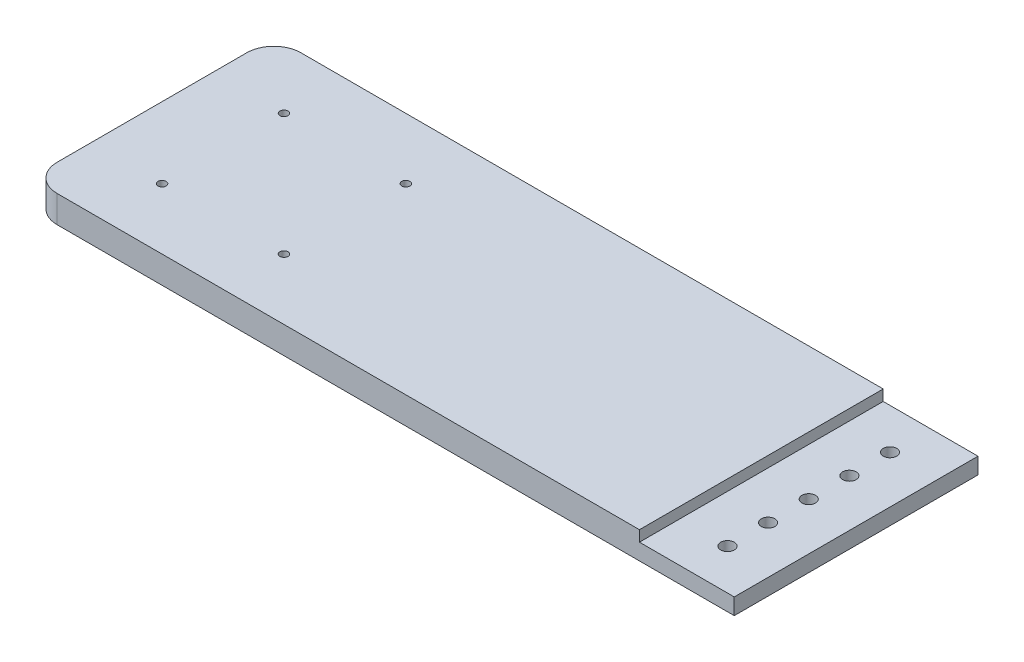
ISO-10303-21;
HEADER;
FILE_DESCRIPTION(('STEP AP214'),'2;1');
FILE_NAME('part.step','',(''),(''),'','','');
FILE_SCHEMA(('AUTOMOTIVE_DESIGN { 1 0 10303 214 1 1 1 1 }'));
ENDSEC;
DATA;
#1=APPLICATION_CONTEXT('core data for automotive mechanical design processes');
#2=APPLICATION_PROTOCOL_DEFINITION('international standard','automotive_design',2000,#1);
#3=PRODUCT_CONTEXT('',#1,'mechanical');
#4=PRODUCT('Part','Part','',(#3));
#5=PRODUCT_RELATED_PRODUCT_CATEGORY('part','',(#4));
#6=PRODUCT_DEFINITION_FORMATION('','',#4);
#7=PRODUCT_DEFINITION_CONTEXT('part definition',#1,'design');
#8=PRODUCT_DEFINITION('design','',#6,#7);
#9=PRODUCT_DEFINITION_SHAPE('','',#8);
#10=(LENGTH_UNIT() NAMED_UNIT(*) SI_UNIT(.MILLI.,.METRE.));
#11=(NAMED_UNIT(*) PLANE_ANGLE_UNIT() SI_UNIT($,.RADIAN.));
#12=(NAMED_UNIT(*) SI_UNIT($,.STERADIAN.) SOLID_ANGLE_UNIT());
#13=UNCERTAINTY_MEASURE_WITH_UNIT(LENGTH_MEASURE(1.E-05),#10,'distance_accuracy_value','');
#14=(GEOMETRIC_REPRESENTATION_CONTEXT(3) GLOBAL_UNCERTAINTY_ASSIGNED_CONTEXT((#13)) GLOBAL_UNIT_ASSIGNED_CONTEXT((#10,
#11,#12)) REPRESENTATION_CONTEXT('',''));
#15=CARTESIAN_POINT('',(0.,0.,0.));
#16=DIRECTION('',(0.,0.,1.));
#17=DIRECTION('',(1.,0.,0.));
#18=AXIS2_PLACEMENT_3D('',#15,#16,#17);
#19=CARTESIAN_POINT('',(26.2394886975501,0.,22.5));
#20=DIRECTION('',(0.,1.,0.));
#21=DIRECTION('',(0.,0.,1.));
#22=AXIS2_PLACEMENT_3D('',#19,#20,#21);
#23=CYLINDRICAL_SURFACE('',#22,1.5);
#24=CARTESIAN_POINT('',(26.2394886975501,10.,22.5));
#25=DIRECTION('',(0.,1.,0.));
#26=DIRECTION('',(0.,0.,1.));
#27=AXIS2_PLACEMENT_3D('',#24,#25,#26);
#28=CIRCLE('',#27,1.5);
#29=CARTESIAN_POINT('',(26.2394886975501,10.,24.));
#30=VERTEX_POINT('',#29);
#31=EDGE_CURVE('E183',#30,#30,#28,.T.);
#32=ORIENTED_EDGE('',*,*,#31,.T.);
#33=EDGE_LOOP('',(#32));
#34=FACE_BOUND('',#33,.T.);
#35=CARTESIAN_POINT('',(26.2394886975501,5.,22.5));
#36=DIRECTION('',(0.,-1.,0.));
#37=DIRECTION('',(0.,0.,-1.));
#38=AXIS2_PLACEMENT_3D('',#35,#36,#37);
#39=CIRCLE('',#38,1.5);
#40=CARTESIAN_POINT('',(26.2394886975501,5.,21.));
#41=VERTEX_POINT('',#40);
#42=EDGE_CURVE('E206',#41,#41,#39,.T.);
#43=ORIENTED_EDGE('',*,*,#42,.T.);
#44=EDGE_LOOP('',(#43));
#45=FACE_BOUND('',#44,.T.);
#46=ADVANCED_FACE('F43',(#34,#45),#23,.F.);
#47=CARTESIAN_POINT('',(26.2394886975501,0.,67.5));
#48=DIRECTION('',(0.,1.,0.));
#49=DIRECTION('',(0.,0.,1.));
#50=AXIS2_PLACEMENT_3D('',#47,#48,#49);
#51=CYLINDRICAL_SURFACE('',#50,1.5);
#52=CARTESIAN_POINT('',(26.2394886975501,10.,67.5));
#53=DIRECTION('',(0.,1.,0.));
#54=DIRECTION('',(0.,0.,1.));
#55=AXIS2_PLACEMENT_3D('',#52,#53,#54);
#56=CIRCLE('',#55,1.5);
#57=CARTESIAN_POINT('',(26.2394886975501,10.,69.));
#58=VERTEX_POINT('',#57);
#59=EDGE_CURVE('E188',#58,#58,#56,.T.);
#60=ORIENTED_EDGE('',*,*,#59,.T.);
#61=EDGE_LOOP('',(#60));
#62=FACE_BOUND('',#61,.T.);
#63=CARTESIAN_POINT('',(26.2394886975501,5.,67.5));
#64=DIRECTION('',(0.,-1.,0.));
#65=DIRECTION('',(0.,0.,-1.));
#66=AXIS2_PLACEMENT_3D('',#63,#64,#65);
#67=CIRCLE('',#66,1.5);
#68=CARTESIAN_POINT('',(26.2394886975501,5.,66.));
#69=VERTEX_POINT('',#68);
#70=EDGE_CURVE('E201',#69,#69,#67,.T.);
#71=ORIENTED_EDGE('',*,*,#70,.T.);
#72=EDGE_LOOP('',(#71));
#73=FACE_BOUND('',#72,.T.);
#74=ADVANCED_FACE('F316',(#62,#73),#51,.F.);
#75=CARTESIAN_POINT('',(71.2394886975501,0.,67.5));
#76=DIRECTION('',(0.,1.,0.));
#77=DIRECTION('',(0.,0.,1.));
#78=AXIS2_PLACEMENT_3D('',#75,#76,#77);
#79=CYLINDRICAL_SURFACE('',#78,1.5);
#80=CARTESIAN_POINT('',(71.2394886975501,10.,67.5));
#81=DIRECTION('',(0.,1.,0.));
#82=DIRECTION('',(0.,0.,1.));
#83=AXIS2_PLACEMENT_3D('',#80,#81,#82);
#84=CIRCLE('',#83,1.5);
#85=CARTESIAN_POINT('',(71.2394886975501,10.,69.));
#86=VERTEX_POINT('',#85);
#87=EDGE_CURVE('E192',#86,#86,#84,.T.);
#88=ORIENTED_EDGE('',*,*,#87,.T.);
#89=EDGE_LOOP('',(#88));
#90=FACE_BOUND('',#89,.T.);
#91=CARTESIAN_POINT('',(71.2394886975501,5.,67.5));
#92=DIRECTION('',(0.,-1.,0.));
#93=DIRECTION('',(0.,0.,-1.));
#94=AXIS2_PLACEMENT_3D('',#91,#92,#93);
#95=CIRCLE('',#94,1.5);
#96=CARTESIAN_POINT('',(71.2394886975501,5.,66.));
#97=VERTEX_POINT('',#96);
#98=EDGE_CURVE('E207',#97,#97,#95,.T.);
#99=ORIENTED_EDGE('',*,*,#98,.T.);
#100=EDGE_LOOP('',(#99));
#101=FACE_BOUND('',#100,.T.);
#102=ADVANCED_FACE('F323',(#90,#101),#79,.F.);
#103=CARTESIAN_POINT('',(71.2394886975501,0.,22.5));
#104=DIRECTION('',(0.,1.,0.));
#105=DIRECTION('',(0.,0.,1.));
#106=AXIS2_PLACEMENT_3D('',#103,#104,#105);
#107=CYLINDRICAL_SURFACE('',#106,1.5);
#108=CARTESIAN_POINT('',(71.2394886975501,10.,22.5));
#109=DIRECTION('',(0.,1.,0.));
#110=DIRECTION('',(0.,0.,1.));
#111=AXIS2_PLACEMENT_3D('',#108,#109,#110);
#112=CIRCLE('',#111,1.5);
#113=CARTESIAN_POINT('',(71.2394886975501,10.,24.));
#114=VERTEX_POINT('',#113);
#115=EDGE_CURVE('E189',#114,#114,#112,.T.);
#116=ORIENTED_EDGE('',*,*,#115,.T.);
#117=EDGE_LOOP('',(#116));
#118=FACE_BOUND('',#117,.T.);
#119=CARTESIAN_POINT('',(71.2394886975501,5.,22.5));
#120=DIRECTION('',(0.,-1.,0.));
#121=DIRECTION('',(0.,0.,-1.));
#122=AXIS2_PLACEMENT_3D('',#119,#120,#121);
#123=CIRCLE('',#122,1.5);
#124=CARTESIAN_POINT('',(71.2394886975501,5.,21.));
#125=VERTEX_POINT('',#124);
#126=EDGE_CURVE('E218',#125,#125,#123,.T.);
#127=ORIENTED_EDGE('',*,*,#126,.T.);
#128=EDGE_LOOP('',(#127));
#129=FACE_BOUND('',#128,.T.);
#130=ADVANCED_FACE('F327',(#118,#129),#107,.F.);
#131=CARTESIAN_POINT('',(0.,10.,0.));
#132=DIRECTION('',(1.,0.,0.));
#133=DIRECTION('',(0.,0.,-1.));
#134=AXIS2_PLACEMENT_3D('',#131,#132,#133);
#135=PLANE('',#134);
#136=DIRECTION('',(0.,0.,1.));
#137=VECTOR('',#136,1.);
#138=CARTESIAN_POINT('',(0.,10.,0.));
#139=LINE('',#138,#137);
#140=CARTESIAN_POINT('',(0.,10.,10.));
#141=VERTEX_POINT('',#140);
#142=CARTESIAN_POINT('',(0.,10.,80.));
#143=VERTEX_POINT('',#142);
#144=EDGE_CURVE('E158',#141,#143,#139,.T.);
#145=ORIENTED_EDGE('',*,*,#144,.F.);
#146=DIRECTION('',(0.,-1.,0.));
#147=VECTOR('',#146,1.);
#148=CARTESIAN_POINT('',(0.,10.,10.));
#149=LINE('',#148,#147);
#150=CARTESIAN_POINT('',(0.,0.,10.));
#151=VERTEX_POINT('',#150);
#152=EDGE_CURVE('E147',#141,#151,#149,.T.);
#153=ORIENTED_EDGE('',*,*,#152,.T.);
#154=DIRECTION('',(0.,0.,1.));
#155=VECTOR('',#154,1.);
#156=CARTESIAN_POINT('',(0.,0.,0.));
#157=LINE('',#156,#155);
#158=CARTESIAN_POINT('',(0.,0.,80.));
#159=VERTEX_POINT('',#158);
#160=EDGE_CURVE('E171',#151,#159,#157,.T.);
#161=ORIENTED_EDGE('',*,*,#160,.T.);
#162=DIRECTION('',(0.,-1.,0.));
#163=VECTOR('',#162,1.);
#164=CARTESIAN_POINT('',(0.,10.,80.));
#165=LINE('',#164,#163);
#166=EDGE_CURVE('E138',#159,#143,#165,.F.);
#167=ORIENTED_EDGE('',*,*,#166,.T.);
#168=EDGE_LOOP('',(#145,#153,#161,#167));
#169=FACE_BOUND('',#168,.T.);
#170=ADVANCED_FACE('F163',(#169),#135,.F.);
#171=CARTESIAN_POINT('',(0.,10.,90.));
#172=DIRECTION('',(0.,0.,-1.));
#173=DIRECTION('',(-1.,0.,0.));
#174=AXIS2_PLACEMENT_3D('',#171,#172,#173);
#175=PLANE('',#174);
#176=DIRECTION('',(1.,0.,0.));
#177=VECTOR('',#176,1.);
#178=CARTESIAN_POINT('',(0.,10.,90.));
#179=LINE('',#178,#177);
#180=CARTESIAN_POINT('',(10.,10.,90.));
#181=VERTEX_POINT('',#180);
#182=CARTESIAN_POINT('',(225.,10.,90.));
#183=VERTEX_POINT('',#182);
#184=EDGE_CURVE('E140',#181,#183,#179,.T.);
#185=ORIENTED_EDGE('',*,*,#184,.F.);
#186=DIRECTION('',(0.,-1.,0.));
#187=VECTOR('',#186,1.);
#188=CARTESIAN_POINT('',(10.,10.,90.));
#189=LINE('',#188,#187);
#190=CARTESIAN_POINT('',(10.,0.,90.));
#191=VERTEX_POINT('',#190);
#192=EDGE_CURVE('E11',#181,#191,#189,.T.);
#193=ORIENTED_EDGE('',*,*,#192,.T.);
#194=DIRECTION('',(1.,0.,0.));
#195=VECTOR('',#194,1.);
#196=CARTESIAN_POINT('',(0.,0.,90.));
#197=LINE('',#196,#195);
#198=CARTESIAN_POINT('',(260.,0.,90.));
#199=VERTEX_POINT('',#198);
#200=EDGE_CURVE('E172',#191,#199,#197,.T.);
#201=ORIENTED_EDGE('',*,*,#200,.T.);
#202=DIRECTION('',(0.,-1.,0.));
#203=VECTOR('',#202,1.);
#204=CARTESIAN_POINT('',(260.,10.,90.));
#205=LINE('',#204,#203);
#206=CARTESIAN_POINT('',(260.,6.,90.));
#207=VERTEX_POINT('',#206);
#208=EDGE_CURVE('E135',#207,#199,#205,.T.);
#209=ORIENTED_EDGE('',*,*,#208,.F.);
#210=DIRECTION('',(1.,0.,0.));
#211=VECTOR('',#210,1.);
#212=CARTESIAN_POINT('',(260.,6.,90.));
#213=LINE('',#212,#211);
#214=CARTESIAN_POINT('',(225.,6.,90.));
#215=VERTEX_POINT('',#214);
#216=EDGE_CURVE('E118',#215,#207,#213,.T.);
#217=ORIENTED_EDGE('',*,*,#216,.F.);
#218=DIRECTION('',(0.,1.,0.));
#219=VECTOR('',#218,1.);
#220=CARTESIAN_POINT('',(225.,6.,90.));
#221=LINE('',#220,#219);
#222=EDGE_CURVE('E175',#215,#183,#221,.T.);
#223=ORIENTED_EDGE('',*,*,#222,.T.);
#224=EDGE_LOOP('',(#185,#193,#201,#209,#217,#223));
#225=FACE_BOUND('',#224,.T.);
#226=ADVANCED_FACE('F339',(#225),#175,.F.);
#227=CARTESIAN_POINT('',(260.,10.,0.));
#228=DIRECTION('',(-1.,0.,0.));
#229=DIRECTION('',(0.,0.,1.));
#230=AXIS2_PLACEMENT_3D('',#227,#228,#229);
#231=PLANE('',#230);
#232=DIRECTION('',(0.,-1.,0.));
#233=VECTOR('',#232,1.);
#234=CARTESIAN_POINT('',(260.,10.,0.));
#235=LINE('',#234,#233);
#236=CARTESIAN_POINT('',(260.,6.,0.));
#237=VERTEX_POINT('',#236);
#238=CARTESIAN_POINT('',(260.,0.,0.));
#239=VERTEX_POINT('',#238);
#240=EDGE_CURVE('E126',#237,#239,#235,.T.);
#241=ORIENTED_EDGE('',*,*,#240,.F.);
#242=DIRECTION('',(0.,0.,-1.));
#243=VECTOR('',#242,1.);
#244=CARTESIAN_POINT('',(260.,6.,0.));
#245=LINE('',#244,#243);
#246=EDGE_CURVE('E111',#207,#237,#245,.T.);
#247=ORIENTED_EDGE('',*,*,#246,.F.);
#248=ORIENTED_EDGE('',*,*,#208,.T.);
#249=DIRECTION('',(0.,0.,-1.));
#250=VECTOR('',#249,1.);
#251=CARTESIAN_POINT('',(260.,0.,0.));
#252=LINE('',#251,#250);
#253=EDGE_CURVE('E133',#199,#239,#252,.T.);
#254=ORIENTED_EDGE('',*,*,#253,.T.);
#255=EDGE_LOOP('',(#241,#247,#248,#254));
#256=FACE_BOUND('',#255,.T.);
#257=ADVANCED_FACE('F131',(#256),#231,.F.);
#258=CARTESIAN_POINT('',(0.,10.,0.));
#259=DIRECTION('',(0.,0.,1.));
#260=DIRECTION('',(1.,0.,0.));
#261=AXIS2_PLACEMENT_3D('',#258,#259,#260);
#262=PLANE('',#261);
#263=DIRECTION('',(-1.,0.,0.));
#264=VECTOR('',#263,1.);
#265=CARTESIAN_POINT('',(0.,0.,0.));
#266=LINE('',#265,#264);
#267=CARTESIAN_POINT('',(10.,0.,0.));
#268=VERTEX_POINT('',#267);
#269=EDGE_CURVE('E143',#239,#268,#266,.T.);
#270=ORIENTED_EDGE('',*,*,#269,.T.);
#271=DIRECTION('',(0.,-1.,0.));
#272=VECTOR('',#271,1.);
#273=CARTESIAN_POINT('',(10.,10.,0.));
#274=LINE('',#273,#272);
#275=CARTESIAN_POINT('',(10.,10.,0.));
#276=VERTEX_POINT('',#275);
#277=EDGE_CURVE('E66',#268,#276,#274,.F.);
#278=ORIENTED_EDGE('',*,*,#277,.T.);
#279=DIRECTION('',(-1.,0.,0.));
#280=VECTOR('',#279,1.);
#281=CARTESIAN_POINT('',(0.,10.,0.));
#282=LINE('',#281,#280);
#283=CARTESIAN_POINT('',(225.,10.,0.));
#284=VERTEX_POINT('',#283);
#285=EDGE_CURVE('E136',#284,#276,#282,.T.);
#286=ORIENTED_EDGE('',*,*,#285,.F.);
#287=DIRECTION('',(0.,1.,0.));
#288=VECTOR('',#287,1.);
#289=CARTESIAN_POINT('',(225.,6.,0.));
#290=LINE('',#289,#288);
#291=CARTESIAN_POINT('',(225.,6.,0.));
#292=VERTEX_POINT('',#291);
#293=EDGE_CURVE('E128',#292,#284,#290,.T.);
#294=ORIENTED_EDGE('',*,*,#293,.F.);
#295=DIRECTION('',(-1.,0.,0.));
#296=VECTOR('',#295,1.);
#297=CARTESIAN_POINT('',(260.,6.,0.));
#298=LINE('',#297,#296);
#299=EDGE_CURVE('E115',#237,#292,#298,.T.);
#300=ORIENTED_EDGE('',*,*,#299,.F.);
#301=ORIENTED_EDGE('',*,*,#240,.T.);
#302=EDGE_LOOP('',(#270,#278,#286,#294,#300,#301));
#303=FACE_BOUND('',#302,.T.);
#304=ADVANCED_FACE('F125',(#303),#262,.F.);
#305=CARTESIAN_POINT('',(0.,10.,0.));
#306=DIRECTION('',(0.,1.,0.));
#307=DIRECTION('',(0.,0.,1.));
#308=AXIS2_PLACEMENT_3D('',#305,#306,#307);
#309=PLANE('',#308);
#310=ORIENTED_EDGE('',*,*,#115,.F.);
#311=EDGE_LOOP('',(#310));
#312=FACE_BOUND('',#311,.T.);
#313=ORIENTED_EDGE('',*,*,#87,.F.);
#314=EDGE_LOOP('',(#313));
#315=FACE_BOUND('',#314,.T.);
#316=ORIENTED_EDGE('',*,*,#59,.F.);
#317=EDGE_LOOP('',(#316));
#318=FACE_BOUND('',#317,.T.);
#319=ORIENTED_EDGE('',*,*,#31,.F.);
#320=EDGE_LOOP('',(#319));
#321=FACE_BOUND('',#320,.T.);
#322=ORIENTED_EDGE('',*,*,#285,.T.);
#323=CARTESIAN_POINT('',(10.,10.,10.));
#324=DIRECTION('',(0.,1.,0.));
#325=DIRECTION('',(0.,0.,1.));
#326=AXIS2_PLACEMENT_3D('',#323,#324,#325);
#327=CIRCLE('',#326,10.);
#328=EDGE_CURVE('E51',#276,#141,#327,.T.);
#329=ORIENTED_EDGE('',*,*,#328,.T.);
#330=ORIENTED_EDGE('',*,*,#144,.T.);
#331=CARTESIAN_POINT('',(10.,10.,80.));
#332=DIRECTION('',(0.,1.,0.));
#333=DIRECTION('',(0.,0.,1.));
#334=AXIS2_PLACEMENT_3D('',#331,#332,#333);
#335=CIRCLE('',#334,10.);
#336=EDGE_CURVE('E58',#143,#181,#335,.T.);
#337=ORIENTED_EDGE('',*,*,#336,.T.);
#338=ORIENTED_EDGE('',*,*,#184,.T.);
#339=DIRECTION('',(0.,0.,1.));
#340=VECTOR('',#339,1.);
#341=CARTESIAN_POINT('',(225.,10.,0.));
#342=LINE('',#341,#340);
#343=EDGE_CURVE('E123',#284,#183,#342,.T.);
#344=ORIENTED_EDGE('',*,*,#343,.F.);
#345=EDGE_LOOP('',(#322,#329,#330,#337,#338,#344));
#346=FACE_BOUND('',#345,.T.);
#347=ADVANCED_FACE('F157',(#312,#315,#318,#321,#346),#309,.T.);
#348=CARTESIAN_POINT('',(0.,0.,0.));
#349=DIRECTION('',(0.,1.,0.));
#350=DIRECTION('',(0.,0.,1.));
#351=AXIS2_PLACEMENT_3D('',#348,#349,#350);
#352=PLANE('',#351);
#353=CARTESIAN_POINT('',(242.5,0.,15.));
#354=DIRECTION('',(0.,1.,0.));
#355=DIRECTION('',(0.,0.,1.));
#356=AXIS2_PLACEMENT_3D('',#353,#354,#355);
#357=CIRCLE('',#356,2.5);
#358=CARTESIAN_POINT('',(242.5,0.,17.5));
#359=VERTEX_POINT('',#358);
#360=EDGE_CURVE('E215',#359,#359,#357,.T.);
#361=ORIENTED_EDGE('',*,*,#360,.T.);
#362=EDGE_LOOP('',(#361));
#363=FACE_BOUND('',#362,.T.);
#364=CARTESIAN_POINT('',(242.5,0.,75.));
#365=DIRECTION('',(0.,1.,0.));
#366=DIRECTION('',(0.,0.,1.));
#367=AXIS2_PLACEMENT_3D('',#364,#365,#366);
#368=CIRCLE('',#367,2.5);
#369=CARTESIAN_POINT('',(242.5,0.,77.5));
#370=VERTEX_POINT('',#369);
#371=EDGE_CURVE('E236',#370,#370,#368,.T.);
#372=ORIENTED_EDGE('',*,*,#371,.T.);
#373=EDGE_LOOP('',(#372));
#374=FACE_BOUND('',#373,.T.);
#375=CARTESIAN_POINT('',(242.5,0.,30.));
#376=DIRECTION('',(0.,1.,0.));
#377=DIRECTION('',(0.,0.,1.));
#378=AXIS2_PLACEMENT_3D('',#375,#376,#377);
#379=CIRCLE('',#378,2.5);
#380=CARTESIAN_POINT('',(242.5,0.,32.5));
#381=VERTEX_POINT('',#380);
#382=EDGE_CURVE('E239',#381,#381,#379,.T.);
#383=ORIENTED_EDGE('',*,*,#382,.T.);
#384=EDGE_LOOP('',(#383));
#385=FACE_BOUND('',#384,.T.);
#386=CARTESIAN_POINT('',(242.5,0.,60.));
#387=DIRECTION('',(0.,1.,0.));
#388=DIRECTION('',(0.,0.,1.));
#389=AXIS2_PLACEMENT_3D('',#386,#387,#388);
#390=CIRCLE('',#389,2.5);
#391=CARTESIAN_POINT('',(242.5,0.,62.5));
#392=VERTEX_POINT('',#391);
#393=EDGE_CURVE('E242',#392,#392,#390,.T.);
#394=ORIENTED_EDGE('',*,*,#393,.T.);
#395=EDGE_LOOP('',(#394));
#396=FACE_BOUND('',#395,.T.);
#397=CARTESIAN_POINT('',(242.5,0.,45.));
#398=DIRECTION('',(0.,1.,0.));
#399=DIRECTION('',(0.,0.,1.));
#400=AXIS2_PLACEMENT_3D('',#397,#398,#399);
#401=CIRCLE('',#400,2.5);
#402=CARTESIAN_POINT('',(242.5,0.,47.5));
#403=VERTEX_POINT('',#402);
#404=EDGE_CURVE('E245',#403,#403,#401,.T.);
#405=ORIENTED_EDGE('',*,*,#404,.T.);
#406=EDGE_LOOP('',(#405));
#407=FACE_BOUND('',#406,.T.);
#408=CARTESIAN_POINT('',(71.2394886975501,0.,67.5));
#409=DIRECTION('',(0.,-1.,0.));
#410=DIRECTION('',(0.,0.,-1.));
#411=AXIS2_PLACEMENT_3D('',#408,#409,#410);
#412=CIRCLE('',#411,3.50000000000001);
#413=CARTESIAN_POINT('',(71.2394886975501,0.,64.));
#414=VERTEX_POINT('',#413);
#415=EDGE_CURVE('E211',#414,#414,#412,.T.);
#416=ORIENTED_EDGE('',*,*,#415,.F.);
#417=EDGE_LOOP('',(#416));
#418=FACE_BOUND('',#417,.T.);
#419=CARTESIAN_POINT('',(71.2394886975501,0.,22.5));
#420=DIRECTION('',(0.,-1.,0.));
#421=DIRECTION('',(0.,0.,-1.));
#422=AXIS2_PLACEMENT_3D('',#419,#420,#421);
#423=CIRCLE('',#422,3.50000000000001);
#424=CARTESIAN_POINT('',(71.2394886975501,0.,19.));
#425=VERTEX_POINT('',#424);
#426=EDGE_CURVE('E222',#425,#425,#423,.T.);
#427=ORIENTED_EDGE('',*,*,#426,.F.);
#428=EDGE_LOOP('',(#427));
#429=FACE_BOUND('',#428,.T.);
#430=CARTESIAN_POINT('',(26.2394886975501,0.,22.5));
#431=DIRECTION('',(0.,-1.,0.));
#432=DIRECTION('',(0.,0.,-1.));
#433=AXIS2_PLACEMENT_3D('',#430,#431,#432);
#434=CIRCLE('',#433,3.5);
#435=CARTESIAN_POINT('',(26.2394886975501,0.,19.));
#436=VERTEX_POINT('',#435);
#437=EDGE_CURVE('E229',#436,#436,#434,.T.);
#438=ORIENTED_EDGE('',*,*,#437,.F.);
#439=EDGE_LOOP('',(#438));
#440=FACE_BOUND('',#439,.T.);
#441=CARTESIAN_POINT('',(26.2394886975501,0.,67.5));
#442=DIRECTION('',(0.,-1.,0.));
#443=DIRECTION('',(0.,0.,-1.));
#444=AXIS2_PLACEMENT_3D('',#441,#442,#443);
#445=CIRCLE('',#444,3.5);
#446=CARTESIAN_POINT('',(26.2394886975501,0.,64.));
#447=VERTEX_POINT('',#446);
#448=EDGE_CURVE('E198',#447,#447,#445,.T.);
#449=ORIENTED_EDGE('',*,*,#448,.F.);
#450=EDGE_LOOP('',(#449));
#451=FACE_BOUND('',#450,.T.);
#452=ORIENTED_EDGE('',*,*,#160,.F.);
#453=CARTESIAN_POINT('',(10.,0.,10.));
#454=DIRECTION('',(0.,1.,0.));
#455=DIRECTION('',(0.,0.,1.));
#456=AXIS2_PLACEMENT_3D('',#453,#454,#455);
#457=CIRCLE('',#456,10.);
#458=EDGE_CURVE('E152',#151,#268,#457,.F.);
#459=ORIENTED_EDGE('',*,*,#458,.T.);
#460=ORIENTED_EDGE('',*,*,#269,.F.);
#461=ORIENTED_EDGE('',*,*,#253,.F.);
#462=ORIENTED_EDGE('',*,*,#200,.F.);
#463=CARTESIAN_POINT('',(10.,0.,80.));
#464=DIRECTION('',(0.,1.,0.));
#465=DIRECTION('',(0.,0.,1.));
#466=AXIS2_PLACEMENT_3D('',#463,#464,#465);
#467=CIRCLE('',#466,10.);
#468=EDGE_CURVE('E150',#191,#159,#467,.F.);
#469=ORIENTED_EDGE('',*,*,#468,.T.);
#470=EDGE_LOOP('',(#452,#459,#460,#461,#462,#469));
#471=FACE_BOUND('',#470,.T.);
#472=ADVANCED_FACE('F170',(#363,#374,#385,#396,#407,#418,#429,#440,#451,#471),#352,.F.);
#473=CARTESIAN_POINT('',(225.,6.,0.));
#474=DIRECTION('',(-1.,0.,0.));
#475=DIRECTION('',(0.,0.,1.));
#476=AXIS2_PLACEMENT_3D('',#473,#474,#475);
#477=PLANE('',#476);
#478=ORIENTED_EDGE('',*,*,#343,.T.);
#479=ORIENTED_EDGE('',*,*,#222,.F.);
#480=DIRECTION('',(0.,0.,1.));
#481=VECTOR('',#480,1.);
#482=CARTESIAN_POINT('',(225.,6.,0.));
#483=LINE('',#482,#481);
#484=EDGE_CURVE('E129',#292,#215,#483,.T.);
#485=ORIENTED_EDGE('',*,*,#484,.F.);
#486=ORIENTED_EDGE('',*,*,#293,.T.);
#487=EDGE_LOOP('',(#478,#479,#485,#486));
#488=FACE_BOUND('',#487,.T.);
#489=ADVANCED_FACE('F270',(#488),#477,.F.);
#490=CARTESIAN_POINT('',(0.,6.,0.));
#491=DIRECTION('',(0.,-1.,0.));
#492=DIRECTION('',(0.,0.,-1.));
#493=AXIS2_PLACEMENT_3D('',#490,#491,#492);
#494=PLANE('',#493);
#495=CARTESIAN_POINT('',(242.5,6.,15.));
#496=DIRECTION('',(0.,1.,0.));
#497=DIRECTION('',(0.,0.,1.));
#498=AXIS2_PLACEMENT_3D('',#495,#496,#497);
#499=CIRCLE('',#498,2.5);
#500=CARTESIAN_POINT('',(242.5,6.,17.5));
#501=VERTEX_POINT('',#500);
#502=EDGE_CURVE('E251',#501,#501,#499,.T.);
#503=ORIENTED_EDGE('',*,*,#502,.F.);
#504=EDGE_LOOP('',(#503));
#505=FACE_BOUND('',#504,.T.);
#506=CARTESIAN_POINT('',(242.5,6.,75.));
#507=DIRECTION('',(0.,1.,0.));
#508=DIRECTION('',(0.,0.,1.));
#509=AXIS2_PLACEMENT_3D('',#506,#507,#508);
#510=CIRCLE('',#509,2.5);
#511=CARTESIAN_POINT('',(242.5,6.,77.5));
#512=VERTEX_POINT('',#511);
#513=EDGE_CURVE('E252',#512,#512,#510,.T.);
#514=ORIENTED_EDGE('',*,*,#513,.F.);
#515=EDGE_LOOP('',(#514));
#516=FACE_BOUND('',#515,.T.);
#517=CARTESIAN_POINT('',(242.5,6.,30.));
#518=DIRECTION('',(0.,1.,0.));
#519=DIRECTION('',(0.,0.,1.));
#520=AXIS2_PLACEMENT_3D('',#517,#518,#519);
#521=CIRCLE('',#520,2.5);
#522=CARTESIAN_POINT('',(242.5,6.,32.5));
#523=VERTEX_POINT('',#522);
#524=EDGE_CURVE('E255',#523,#523,#521,.T.);
#525=ORIENTED_EDGE('',*,*,#524,.F.);
#526=EDGE_LOOP('',(#525));
#527=FACE_BOUND('',#526,.T.);
#528=CARTESIAN_POINT('',(242.5,6.,60.));
#529=DIRECTION('',(0.,1.,0.));
#530=DIRECTION('',(0.,0.,1.));
#531=AXIS2_PLACEMENT_3D('',#528,#529,#530);
#532=CIRCLE('',#531,2.5);
#533=CARTESIAN_POINT('',(242.5,6.,62.5));
#534=VERTEX_POINT('',#533);
#535=EDGE_CURVE('E258',#534,#534,#532,.T.);
#536=ORIENTED_EDGE('',*,*,#535,.F.);
#537=EDGE_LOOP('',(#536));
#538=FACE_BOUND('',#537,.T.);
#539=CARTESIAN_POINT('',(242.5,6.,45.));
#540=DIRECTION('',(0.,1.,0.));
#541=DIRECTION('',(0.,0.,1.));
#542=AXIS2_PLACEMENT_3D('',#539,#540,#541);
#543=CIRCLE('',#542,2.5);
#544=CARTESIAN_POINT('',(242.5,6.,47.5));
#545=VERTEX_POINT('',#544);
#546=EDGE_CURVE('E248',#545,#545,#543,.T.);
#547=ORIENTED_EDGE('',*,*,#546,.F.);
#548=EDGE_LOOP('',(#547));
#549=FACE_BOUND('',#548,.T.);
#550=ORIENTED_EDGE('',*,*,#246,.T.);
#551=ORIENTED_EDGE('',*,*,#299,.T.);
#552=ORIENTED_EDGE('',*,*,#484,.T.);
#553=ORIENTED_EDGE('',*,*,#216,.T.);
#554=EDGE_LOOP('',(#550,#551,#552,#553));
#555=FACE_BOUND('',#554,.T.);
#556=ADVANCED_FACE('F113',(#505,#516,#527,#538,#549,#555),#494,.F.);
#557=CARTESIAN_POINT('',(71.2394886975501,5.,22.5));
#558=DIRECTION('',(0.,-1.,0.));
#559=DIRECTION('',(0.,0.,-1.));
#560=AXIS2_PLACEMENT_3D('',#557,#558,#559);
#561=CYLINDRICAL_SURFACE('',#560,3.50000000000001);
#562=CARTESIAN_POINT('',(71.2394886975501,5.,22.5));
#563=DIRECTION('',(0.,-1.,0.));
#564=DIRECTION('',(0.,0.,-1.));
#565=AXIS2_PLACEMENT_3D('',#562,#563,#564);
#566=CIRCLE('',#565,3.50000000000001);
#567=CARTESIAN_POINT('',(71.2394886975501,5.,19.));
#568=VERTEX_POINT('',#567);
#569=EDGE_CURVE('E210',#568,#568,#566,.T.);
#570=ORIENTED_EDGE('',*,*,#569,.F.);
#571=EDGE_LOOP('',(#570));
#572=FACE_BOUND('',#571,.T.);
#573=ORIENTED_EDGE('',*,*,#426,.T.);
#574=EDGE_LOOP('',(#573));
#575=FACE_BOUND('',#574,.T.);
#576=ADVANCED_FACE('F269',(#572,#575),#561,.F.);
#577=CARTESIAN_POINT('',(71.2394886975501,5.,22.5));
#578=DIRECTION('',(0.,-1.,0.));
#579=DIRECTION('',(0.,0.,-1.));
#580=AXIS2_PLACEMENT_3D('',#577,#578,#579);
#581=PLANE('',#580);
#582=ORIENTED_EDGE('',*,*,#126,.F.);
#583=EDGE_LOOP('',(#582));
#584=FACE_BOUND('',#583,.T.);
#585=ORIENTED_EDGE('',*,*,#569,.T.);
#586=EDGE_LOOP('',(#585));
#587=FACE_BOUND('',#586,.T.);
#588=ADVANCED_FACE('F371',(#584,#587),#581,.T.);
#589=CARTESIAN_POINT('',(71.2394886975501,5.,67.5));
#590=DIRECTION('',(0.,-1.,0.));
#591=DIRECTION('',(0.,0.,-1.));
#592=AXIS2_PLACEMENT_3D('',#589,#590,#591);
#593=CYLINDRICAL_SURFACE('',#592,3.50000000000001);
#594=CARTESIAN_POINT('',(71.2394886975501,5.,67.5));
#595=DIRECTION('',(0.,-1.,0.));
#596=DIRECTION('',(0.,0.,-1.));
#597=AXIS2_PLACEMENT_3D('',#594,#595,#596);
#598=CIRCLE('',#597,3.50000000000001);
#599=CARTESIAN_POINT('',(71.2394886975501,5.,64.));
#600=VERTEX_POINT('',#599);
#601=EDGE_CURVE('E212',#600,#600,#598,.T.);
#602=ORIENTED_EDGE('',*,*,#601,.F.);
#603=EDGE_LOOP('',(#602));
#604=FACE_BOUND('',#603,.T.);
#605=ORIENTED_EDGE('',*,*,#415,.T.);
#606=EDGE_LOOP('',(#605));
#607=FACE_BOUND('',#606,.T.);
#608=ADVANCED_FACE('F310',(#604,#607),#593,.F.);
#609=CARTESIAN_POINT('',(71.2394886975501,5.,67.5));
#610=DIRECTION('',(0.,-1.,0.));
#611=DIRECTION('',(0.,0.,-1.));
#612=AXIS2_PLACEMENT_3D('',#609,#610,#611);
#613=PLANE('',#612);
#614=ORIENTED_EDGE('',*,*,#98,.F.);
#615=EDGE_LOOP('',(#614));
#616=FACE_BOUND('',#615,.T.);
#617=ORIENTED_EDGE('',*,*,#601,.T.);
#618=EDGE_LOOP('',(#617));
#619=FACE_BOUND('',#618,.T.);
#620=ADVANCED_FACE('F300',(#616,#619),#613,.T.);
#621=CARTESIAN_POINT('',(26.2394886975501,5.,67.5));
#622=DIRECTION('',(0.,-1.,0.));
#623=DIRECTION('',(0.,0.,-1.));
#624=AXIS2_PLACEMENT_3D('',#621,#622,#623);
#625=CYLINDRICAL_SURFACE('',#624,3.5);
#626=CARTESIAN_POINT('',(26.2394886975501,5.,67.5));
#627=DIRECTION('',(0.,-1.,0.));
#628=DIRECTION('',(0.,0.,-1.));
#629=AXIS2_PLACEMENT_3D('',#626,#627,#628);
#630=CIRCLE('',#629,3.5);
#631=CARTESIAN_POINT('',(26.2394886975501,5.,64.));
#632=VERTEX_POINT('',#631);
#633=EDGE_CURVE('E193',#632,#632,#630,.T.);
#634=ORIENTED_EDGE('',*,*,#633,.F.);
#635=EDGE_LOOP('',(#634));
#636=FACE_BOUND('',#635,.T.);
#637=ORIENTED_EDGE('',*,*,#448,.T.);
#638=EDGE_LOOP('',(#637));
#639=FACE_BOUND('',#638,.T.);
#640=ADVANCED_FACE('F297',(#636,#639),#625,.F.);
#641=CARTESIAN_POINT('',(26.2394886975501,5.,67.5));
#642=DIRECTION('',(0.,-1.,0.));
#643=DIRECTION('',(0.,0.,-1.));
#644=AXIS2_PLACEMENT_3D('',#641,#642,#643);
#645=PLANE('',#644);
#646=ORIENTED_EDGE('',*,*,#70,.F.);
#647=EDGE_LOOP('',(#646));
#648=FACE_BOUND('',#647,.T.);
#649=ORIENTED_EDGE('',*,*,#633,.T.);
#650=EDGE_LOOP('',(#649));
#651=FACE_BOUND('',#650,.T.);
#652=ADVANCED_FACE('F299',(#648,#651),#645,.T.);
#653=CARTESIAN_POINT('',(26.2394886975501,5.,22.5));
#654=DIRECTION('',(0.,-1.,0.));
#655=DIRECTION('',(0.,0.,-1.));
#656=AXIS2_PLACEMENT_3D('',#653,#654,#655);
#657=CYLINDRICAL_SURFACE('',#656,3.5);
#658=CARTESIAN_POINT('',(26.2394886975501,5.,22.5));
#659=DIRECTION('',(0.,-1.,0.));
#660=DIRECTION('',(0.,0.,-1.));
#661=AXIS2_PLACEMENT_3D('',#658,#659,#660);
#662=CIRCLE('',#661,3.5);
#663=CARTESIAN_POINT('',(26.2394886975501,5.,19.));
#664=VERTEX_POINT('',#663);
#665=EDGE_CURVE('E221',#664,#664,#662,.T.);
#666=ORIENTED_EDGE('',*,*,#665,.F.);
#667=EDGE_LOOP('',(#666));
#668=FACE_BOUND('',#667,.T.);
#669=ORIENTED_EDGE('',*,*,#437,.T.);
#670=EDGE_LOOP('',(#669));
#671=FACE_BOUND('',#670,.T.);
#672=ADVANCED_FACE('F307',(#668,#671),#657,.F.);
#673=CARTESIAN_POINT('',(26.2394886975501,5.,22.5));
#674=DIRECTION('',(0.,-1.,0.));
#675=DIRECTION('',(0.,0.,-1.));
#676=AXIS2_PLACEMENT_3D('',#673,#674,#675);
#677=PLANE('',#676);
#678=ORIENTED_EDGE('',*,*,#42,.F.);
#679=EDGE_LOOP('',(#678));
#680=FACE_BOUND('',#679,.T.);
#681=ORIENTED_EDGE('',*,*,#665,.T.);
#682=EDGE_LOOP('',(#681));
#683=FACE_BOUND('',#682,.T.);
#684=ADVANCED_FACE('F281',(#680,#683),#677,.T.);
#685=CARTESIAN_POINT('',(242.5,-19.,45.));
#686=DIRECTION('',(0.,1.,0.));
#687=DIRECTION('',(0.,0.,1.));
#688=AXIS2_PLACEMENT_3D('',#685,#686,#687);
#689=CYLINDRICAL_SURFACE('',#688,2.5);
#690=ORIENTED_EDGE('',*,*,#546,.T.);
#691=EDGE_LOOP('',(#690));
#692=FACE_BOUND('',#691,.T.);
#693=ORIENTED_EDGE('',*,*,#404,.F.);
#694=EDGE_LOOP('',(#693));
#695=FACE_BOUND('',#694,.T.);
#696=ADVANCED_FACE('F277',(#692,#695),#689,.F.);
#697=CARTESIAN_POINT('',(242.5,-19.,60.));
#698=DIRECTION('',(0.,1.,0.));
#699=DIRECTION('',(0.,0.,1.));
#700=AXIS2_PLACEMENT_3D('',#697,#698,#699);
#701=CYLINDRICAL_SURFACE('',#700,2.5);
#702=ORIENTED_EDGE('',*,*,#535,.T.);
#703=EDGE_LOOP('',(#702));
#704=FACE_BOUND('',#703,.T.);
#705=ORIENTED_EDGE('',*,*,#393,.F.);
#706=EDGE_LOOP('',(#705));
#707=FACE_BOUND('',#706,.T.);
#708=ADVANCED_FACE('F280',(#704,#707),#701,.F.);
#709=CARTESIAN_POINT('',(242.5,-19.,30.));
#710=DIRECTION('',(0.,1.,0.));
#711=DIRECTION('',(0.,0.,1.));
#712=AXIS2_PLACEMENT_3D('',#709,#710,#711);
#713=CYLINDRICAL_SURFACE('',#712,2.5);
#714=ORIENTED_EDGE('',*,*,#524,.T.);
#715=EDGE_LOOP('',(#714));
#716=FACE_BOUND('',#715,.T.);
#717=ORIENTED_EDGE('',*,*,#382,.F.);
#718=EDGE_LOOP('',(#717));
#719=FACE_BOUND('',#718,.T.);
#720=ADVANCED_FACE('F264',(#716,#719),#713,.F.);
#721=CARTESIAN_POINT('',(242.5,-19.,75.));
#722=DIRECTION('',(0.,1.,0.));
#723=DIRECTION('',(0.,0.,1.));
#724=AXIS2_PLACEMENT_3D('',#721,#722,#723);
#725=CYLINDRICAL_SURFACE('',#724,2.5);
#726=ORIENTED_EDGE('',*,*,#513,.T.);
#727=EDGE_LOOP('',(#726));
#728=FACE_BOUND('',#727,.T.);
#729=ORIENTED_EDGE('',*,*,#371,.F.);
#730=EDGE_LOOP('',(#729));
#731=FACE_BOUND('',#730,.T.);
#732=ADVANCED_FACE('F351',(#728,#731),#725,.F.);
#733=CARTESIAN_POINT('',(242.5,-19.,15.));
#734=DIRECTION('',(0.,1.,0.));
#735=DIRECTION('',(0.,0.,1.));
#736=AXIS2_PLACEMENT_3D('',#733,#734,#735);
#737=CYLINDRICAL_SURFACE('',#736,2.5);
#738=ORIENTED_EDGE('',*,*,#502,.T.);
#739=EDGE_LOOP('',(#738));
#740=FACE_BOUND('',#739,.T.);
#741=ORIENTED_EDGE('',*,*,#360,.F.);
#742=EDGE_LOOP('',(#741));
#743=FACE_BOUND('',#742,.T.);
#744=ADVANCED_FACE('F345',(#740,#743),#737,.F.);
#745=CARTESIAN_POINT('',(10.,10.,10.));
#746=DIRECTION('',(0.,-1.,0.));
#747=DIRECTION('',(0.,0.,-1.));
#748=AXIS2_PLACEMENT_3D('',#745,#746,#747);
#749=CYLINDRICAL_SURFACE('',#748,10.);
#750=ORIENTED_EDGE('',*,*,#328,.F.);
#751=ORIENTED_EDGE('',*,*,#277,.F.);
#752=ORIENTED_EDGE('',*,*,#458,.F.);
#753=ORIENTED_EDGE('',*,*,#152,.F.);
#754=EDGE_LOOP('',(#750,#751,#752,#753));
#755=FACE_BOUND('',#754,.T.);
#756=ADVANCED_FACE('F168',(#755),#749,.T.);
#757=CARTESIAN_POINT('',(10.,10.,80.));
#758=DIRECTION('',(0.,-1.,0.));
#759=DIRECTION('',(0.,0.,-1.));
#760=AXIS2_PLACEMENT_3D('',#757,#758,#759);
#761=CYLINDRICAL_SURFACE('',#760,10.);
#762=ORIENTED_EDGE('',*,*,#336,.F.);
#763=ORIENTED_EDGE('',*,*,#166,.F.);
#764=ORIENTED_EDGE('',*,*,#468,.F.);
#765=ORIENTED_EDGE('',*,*,#192,.F.);
#766=EDGE_LOOP('',(#762,#763,#764,#765));
#767=FACE_BOUND('',#766,.T.);
#768=ADVANCED_FACE('F45',(#767),#761,.T.);
#769=CLOSED_SHELL('',(#46,#74,#102,#130,#170,#226,#257,#304,#347,#472,#489,#556,#576,#588,#608,
#620,#640,#652,#672,#684,#696,#708,#720,#732,#744,#756,#768));
#770=MANIFOLD_SOLID_BREP('B2',#769);
#771=ADVANCED_BREP_SHAPE_REPRESENTATION('',(#18,#770),#14);
#772=SHAPE_DEFINITION_REPRESENTATION(#9,#771);
ENDSEC;
END-ISO-10303-21;
